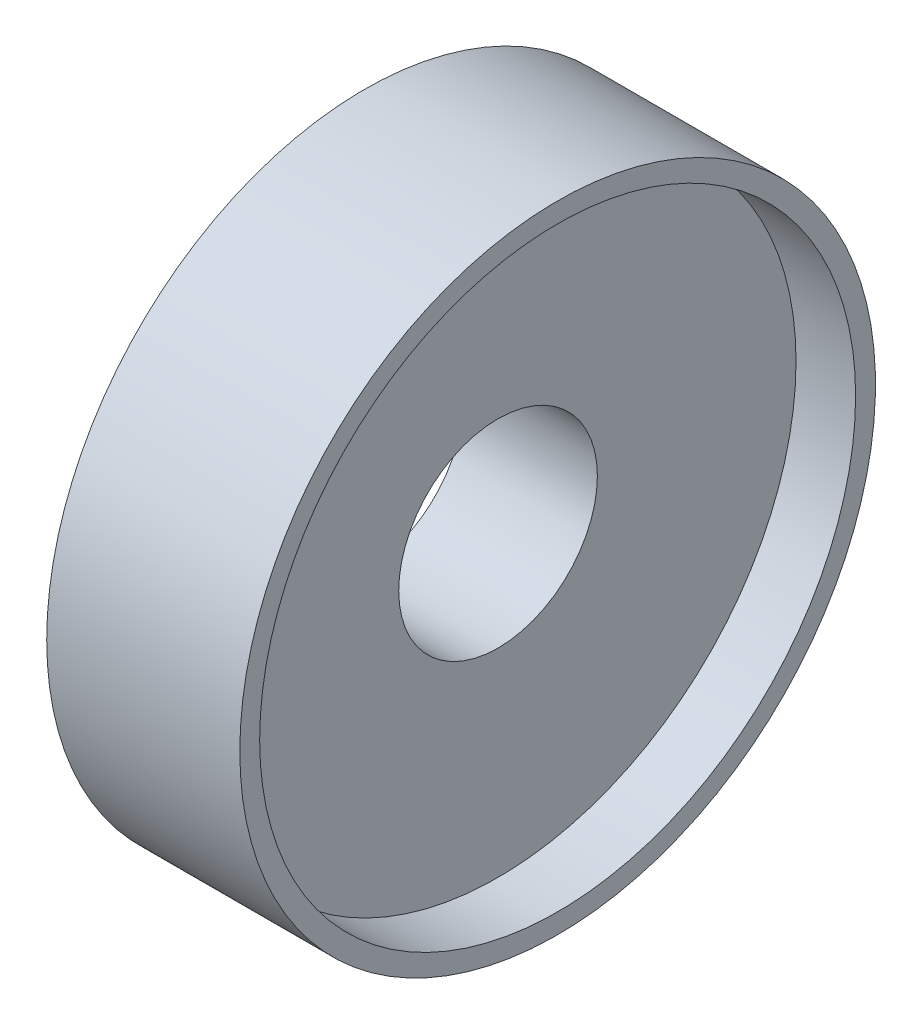
ISO-10303-21;
HEADER;
FILE_DESCRIPTION(('STEP AP214'),'2;1');
FILE_NAME('part.step','',(''),(''),'','','');
FILE_SCHEMA(('AUTOMOTIVE_DESIGN { 1 0 10303 214 1 1 1 1 }'));
ENDSEC;
DATA;
#1=APPLICATION_CONTEXT('core data for automotive mechanical design processes');
#2=APPLICATION_PROTOCOL_DEFINITION('international standard','automotive_design',2000,#1);
#3=PRODUCT_CONTEXT('',#1,'mechanical');
#4=PRODUCT('Part','Part','',(#3));
#5=PRODUCT_RELATED_PRODUCT_CATEGORY('part','',(#4));
#6=PRODUCT_DEFINITION_FORMATION('','',#4);
#7=PRODUCT_DEFINITION_CONTEXT('part definition',#1,'design');
#8=PRODUCT_DEFINITION('design','',#6,#7);
#9=PRODUCT_DEFINITION_SHAPE('','',#8);
#10=(LENGTH_UNIT() NAMED_UNIT(*) SI_UNIT(.MILLI.,.METRE.));
#11=(NAMED_UNIT(*) PLANE_ANGLE_UNIT() SI_UNIT($,.RADIAN.));
#12=(NAMED_UNIT(*) SI_UNIT($,.STERADIAN.) SOLID_ANGLE_UNIT());
#13=UNCERTAINTY_MEASURE_WITH_UNIT(LENGTH_MEASURE(1.E-05),#10,'distance_accuracy_value','');
#14=(GEOMETRIC_REPRESENTATION_CONTEXT(3) GLOBAL_UNCERTAINTY_ASSIGNED_CONTEXT((#13)) GLOBAL_UNIT_ASSIGNED_CONTEXT((#10,
#11,#12)) REPRESENTATION_CONTEXT('',''));
#15=CARTESIAN_POINT('',(0.,0.,0.));
#16=DIRECTION('',(0.,0.,1.));
#17=DIRECTION('',(1.,0.,0.));
#18=AXIS2_PLACEMENT_3D('',#15,#16,#17);
#19=CARTESIAN_POINT('',(21.45,0.,0.));
#20=DIRECTION('',(-1.,0.,0.));
#21=DIRECTION('',(0.,0.,1.));
#22=AXIS2_PLACEMENT_3D('',#19,#20,#21);
#23=CYLINDRICAL_SURFACE('',#22,7.5);
#24=CARTESIAN_POINT('',(20.7,0.,0.));
#25=DIRECTION('',(-1.,0.,0.));
#26=DIRECTION('',(0.,0.,1.));
#27=AXIS2_PLACEMENT_3D('',#24,#25,#26);
#28=CIRCLE('',#27,7.5);
#29=CARTESIAN_POINT('',(20.7,0.,7.5));
#30=VERTEX_POINT('',#29);
#31=EDGE_CURVE('E33',#30,#30,#28,.F.);
#32=ORIENTED_EDGE('',*,*,#31,.F.);
#33=EDGE_LOOP('',(#32));
#34=FACE_BOUND('',#33,.T.);
#35=CARTESIAN_POINT('',(22.2,0.,0.));
#36=DIRECTION('',(-1.,0.,0.));
#37=DIRECTION('',(0.,0.,1.));
#38=AXIS2_PLACEMENT_3D('',#35,#36,#37);
#39=CIRCLE('',#38,7.5);
#40=CARTESIAN_POINT('',(22.2,0.,7.5));
#41=VERTEX_POINT('',#40);
#42=EDGE_CURVE('E17',#41,#41,#39,.T.);
#43=ORIENTED_EDGE('',*,*,#42,.F.);
#44=EDGE_LOOP('',(#43));
#45=FACE_BOUND('',#44,.T.);
#46=ADVANCED_FACE('F14',(#34,#45),#23,.F.);
#47=CARTESIAN_POINT('',(22.2,7.75,0.));
#48=DIRECTION('',(1.,0.,0.));
#49=DIRECTION('',(0.,0.,-1.));
#50=AXIS2_PLACEMENT_3D('',#47,#48,#49);
#51=PLANE('',#50);
#52=CARTESIAN_POINT('',(22.2,0.,0.));
#53=DIRECTION('',(-1.,0.,0.));
#54=DIRECTION('',(0.,0.,1.));
#55=AXIS2_PLACEMENT_3D('',#52,#53,#54);
#56=CIRCLE('',#55,8.);
#57=CARTESIAN_POINT('',(22.2,0.,8.));
#58=VERTEX_POINT('',#57);
#59=EDGE_CURVE('E31',#58,#58,#56,.T.);
#60=ORIENTED_EDGE('',*,*,#59,.F.);
#61=EDGE_LOOP('',(#60));
#62=FACE_BOUND('',#61,.T.);
#63=ORIENTED_EDGE('',*,*,#42,.T.);
#64=EDGE_LOOP('',(#63));
#65=FACE_BOUND('',#64,.T.);
#66=ADVANCED_FACE('F40',(#62,#65),#51,.T.);
#67=CARTESIAN_POINT('',(20.7,5.,0.));
#68=DIRECTION('',(1.,0.,0.));
#69=DIRECTION('',(0.,0.,-1.));
#70=AXIS2_PLACEMENT_3D('',#67,#68,#69);
#71=PLANE('',#70);
#72=ORIENTED_EDGE('',*,*,#31,.T.);
#73=EDGE_LOOP('',(#72));
#74=FACE_BOUND('',#73,.T.);
#75=CARTESIAN_POINT('',(20.7,0.,0.));
#76=DIRECTION('',(-1.,0.,0.));
#77=DIRECTION('',(0.,0.,1.));
#78=AXIS2_PLACEMENT_3D('',#75,#76,#77);
#79=CIRCLE('',#78,2.5);
#80=CARTESIAN_POINT('',(20.7,0.,2.5));
#81=VERTEX_POINT('',#80);
#82=EDGE_CURVE('E26',#81,#81,#79,.T.);
#83=ORIENTED_EDGE('',*,*,#82,.T.);
#84=EDGE_LOOP('',(#83));
#85=FACE_BOUND('',#84,.T.);
#86=ADVANCED_FACE('F48',(#74,#85),#71,.T.);
#87=CARTESIAN_POINT('',(19.77,0.,0.));
#88=DIRECTION('',(-1.,0.,0.));
#89=DIRECTION('',(0.,0.,1.));
#90=AXIS2_PLACEMENT_3D('',#87,#88,#89);
#91=CYLINDRICAL_SURFACE('',#90,8.);
#92=ORIENTED_EDGE('',*,*,#59,.T.);
#93=EDGE_LOOP('',(#92));
#94=FACE_BOUND('',#93,.T.);
#95=CARTESIAN_POINT('',(17.34,0.,0.));
#96=DIRECTION('',(-1.,0.,0.));
#97=DIRECTION('',(0.,0.,1.));
#98=AXIS2_PLACEMENT_3D('',#95,#96,#97);
#99=CIRCLE('',#98,8.);
#100=CARTESIAN_POINT('',(17.34,0.,8.));
#101=VERTEX_POINT('',#100);
#102=EDGE_CURVE('E21',#101,#101,#99,.T.);
#103=ORIENTED_EDGE('',*,*,#102,.F.);
#104=EDGE_LOOP('',(#103));
#105=FACE_BOUND('',#104,.T.);
#106=ADVANCED_FACE('F57',(#94,#105),#91,.T.);
#107=CARTESIAN_POINT('',(19.02,0.,0.));
#108=DIRECTION('',(-1.,0.,0.));
#109=DIRECTION('',(0.,0.,1.));
#110=AXIS2_PLACEMENT_3D('',#107,#108,#109);
#111=CYLINDRICAL_SURFACE('',#110,2.5);
#112=CARTESIAN_POINT('',(17.34,0.,0.));
#113=DIRECTION('',(-1.,0.,0.));
#114=DIRECTION('',(0.,0.,1.));
#115=AXIS2_PLACEMENT_3D('',#112,#113,#114);
#116=CIRCLE('',#115,2.5);
#117=CARTESIAN_POINT('',(17.34,0.,2.5));
#118=VERTEX_POINT('',#117);
#119=EDGE_CURVE('E10',#118,#118,#116,.F.);
#120=ORIENTED_EDGE('',*,*,#119,.F.);
#121=EDGE_LOOP('',(#120));
#122=FACE_BOUND('',#121,.T.);
#123=ORIENTED_EDGE('',*,*,#82,.F.);
#124=EDGE_LOOP('',(#123));
#125=FACE_BOUND('',#124,.T.);
#126=ADVANCED_FACE('F52',(#122,#125),#111,.F.);
#127=CARTESIAN_POINT('',(17.34,5.25,0.));
#128=DIRECTION('',(-1.,0.,0.));
#129=DIRECTION('',(0.,0.,1.));
#130=AXIS2_PLACEMENT_3D('',#127,#128,#129);
#131=PLANE('',#130);
#132=ORIENTED_EDGE('',*,*,#119,.T.);
#133=EDGE_LOOP('',(#132));
#134=FACE_BOUND('',#133,.T.);
#135=ORIENTED_EDGE('',*,*,#102,.T.);
#136=EDGE_LOOP('',(#135));
#137=FACE_BOUND('',#136,.T.);
#138=ADVANCED_FACE('F50',(#134,#137),#131,.T.);
#139=CLOSED_SHELL('',(#46,#66,#86,#106,#126,#138));
#140=MANIFOLD_SOLID_BREP('B1',#139);
#141=ADVANCED_BREP_SHAPE_REPRESENTATION('',(#18,#140),#14);
#142=SHAPE_DEFINITION_REPRESENTATION(#9,#141);
ENDSEC;
END-ISO-10303-21;
